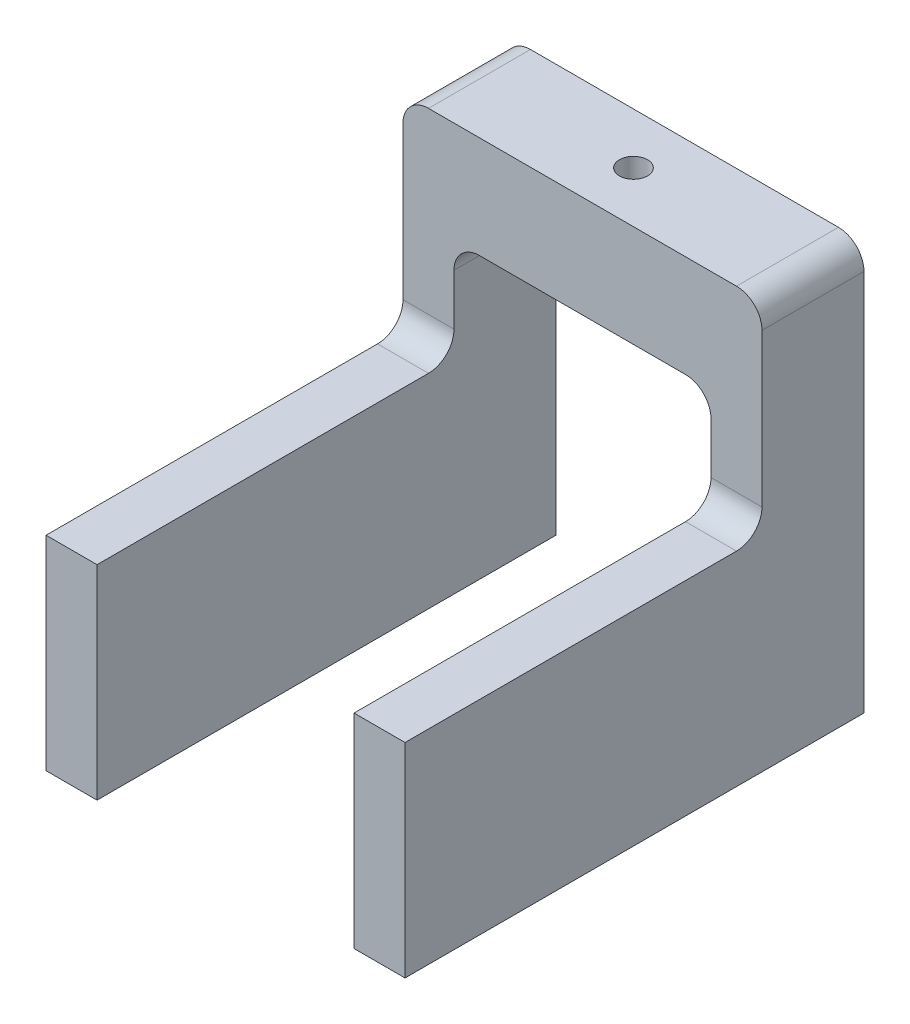
ISO-10303-21;
HEADER;
FILE_DESCRIPTION(('STEP AP214'),'2;1');
FILE_NAME('part.step','',(''),(''),'','','');
FILE_SCHEMA(('AUTOMOTIVE_DESIGN { 1 0 10303 214 1 1 1 1 }'));
ENDSEC;
DATA;
#1=APPLICATION_CONTEXT('core data for automotive mechanical design processes');
#2=APPLICATION_PROTOCOL_DEFINITION('international standard','automotive_design',2000,#1);
#3=PRODUCT_CONTEXT('',#1,'mechanical');
#4=PRODUCT('Part','Part','',(#3));
#5=PRODUCT_RELATED_PRODUCT_CATEGORY('part','',(#4));
#6=PRODUCT_DEFINITION_FORMATION('','',#4);
#7=PRODUCT_DEFINITION_CONTEXT('part definition',#1,'design');
#8=PRODUCT_DEFINITION('design','',#6,#7);
#9=PRODUCT_DEFINITION_SHAPE('','',#8);
#10=(LENGTH_UNIT() NAMED_UNIT(*) SI_UNIT(.MILLI.,.METRE.));
#11=(NAMED_UNIT(*) PLANE_ANGLE_UNIT() SI_UNIT($,.RADIAN.));
#12=(NAMED_UNIT(*) SI_UNIT($,.STERADIAN.) SOLID_ANGLE_UNIT());
#13=UNCERTAINTY_MEASURE_WITH_UNIT(LENGTH_MEASURE(1.E-05),#10,'distance_accuracy_value','');
#14=(GEOMETRIC_REPRESENTATION_CONTEXT(3) GLOBAL_UNCERTAINTY_ASSIGNED_CONTEXT((#13)) GLOBAL_UNIT_ASSIGNED_CONTEXT((#10,
#11,#12)) REPRESENTATION_CONTEXT('',''));
#15=CARTESIAN_POINT('',(0.,0.,0.));
#16=DIRECTION('',(0.,0.,1.));
#17=DIRECTION('',(1.,0.,0.));
#18=AXIS2_PLACEMENT_3D('',#15,#16,#17);
#19=CARTESIAN_POINT('',(89.408,50.8,114.3));
#20=DIRECTION('',(0.,-1.,0.));
#21=DIRECTION('',(0.,0.,-1.));
#22=AXIS2_PLACEMENT_3D('',#19,#20,#21);
#23=PLANE('',#22);
#24=DIRECTION('',(0.,0.,1.));
#25=VECTOR('',#24,1.);
#26=CARTESIAN_POINT('',(89.408,50.8,114.3));
#27=LINE('',#26,#25);
#28=CARTESIAN_POINT('',(89.408,50.8,31.75));
#29=VERTEX_POINT('',#28);
#30=CARTESIAN_POINT('',(89.408,50.8,114.3));
#31=VERTEX_POINT('',#30);
#32=EDGE_CURVE('E307',#29,#31,#27,.T.);
#33=ORIENTED_EDGE('',*,*,#32,.F.);
#34=DIRECTION('',(-1.,0.,0.));
#35=VECTOR('',#34,1.);
#36=CARTESIAN_POINT('',(76.708,50.8,31.75));
#37=LINE('',#36,#35);
#38=CARTESIAN_POINT('',(76.708,50.8,31.75));
#39=VERTEX_POINT('',#38);
#40=EDGE_CURVE('E270',#29,#39,#37,.T.);
#41=ORIENTED_EDGE('',*,*,#40,.T.);
#42=DIRECTION('',(0.,0.,1.));
#43=VECTOR('',#42,1.);
#44=CARTESIAN_POINT('',(76.708,50.8,114.3));
#45=LINE('',#44,#43);
#46=CARTESIAN_POINT('',(76.708,50.8,114.3));
#47=VERTEX_POINT('',#46);
#48=EDGE_CURVE('E293',#39,#47,#45,.T.);
#49=ORIENTED_EDGE('',*,*,#48,.T.);
#50=DIRECTION('',(-1.,0.,0.));
#51=VECTOR('',#50,1.);
#52=CARTESIAN_POINT('',(89.408,50.8,114.3));
#53=LINE('',#52,#51);
#54=EDGE_CURVE('E190',#31,#47,#53,.T.);
#55=ORIENTED_EDGE('',*,*,#54,.F.);
#56=EDGE_LOOP('',(#33,#41,#49,#55));
#57=FACE_BOUND('',#56,.T.);
#58=ADVANCED_FACE('F39',(#57),#23,.F.);
#59=CARTESIAN_POINT('',(89.408,0.,114.3));
#60=DIRECTION('',(0.,0.,-1.));
#61=DIRECTION('',(-1.,0.,0.));
#62=AXIS2_PLACEMENT_3D('',#59,#60,#61);
#63=PLANE('',#62);
#64=ORIENTED_EDGE('',*,*,#54,.T.);
#65=DIRECTION('',(0.,-1.,0.));
#66=VECTOR('',#65,1.);
#67=CARTESIAN_POINT('',(76.708,0.,114.3));
#68=LINE('',#67,#66);
#69=CARTESIAN_POINT('',(76.708,0.,114.3));
#70=VERTEX_POINT('',#69);
#71=EDGE_CURVE('E170',#47,#70,#68,.T.);
#72=ORIENTED_EDGE('',*,*,#71,.T.);
#73=DIRECTION('',(-1.,0.,0.));
#74=VECTOR('',#73,1.);
#75=CARTESIAN_POINT('',(89.408,0.,114.3));
#76=LINE('',#75,#74);
#77=CARTESIAN_POINT('',(89.408,0.,114.3));
#78=VERTEX_POINT('',#77);
#79=EDGE_CURVE('E187',#78,#70,#76,.T.);
#80=ORIENTED_EDGE('',*,*,#79,.F.);
#81=DIRECTION('',(0.,-1.,0.));
#82=VECTOR('',#81,1.);
#83=CARTESIAN_POINT('',(89.408,0.,114.3));
#84=LINE('',#83,#82);
#85=EDGE_CURVE('E311',#31,#78,#84,.T.);
#86=ORIENTED_EDGE('',*,*,#85,.F.);
#87=EDGE_LOOP('',(#64,#72,#80,#86));
#88=FACE_BOUND('',#87,.T.);
#89=ADVANCED_FACE('F185',(#88),#63,.F.);
#90=CARTESIAN_POINT('',(89.408,0.,0.));
#91=DIRECTION('',(0.,1.,0.));
#92=DIRECTION('',(0.,0.,1.));
#93=AXIS2_PLACEMENT_3D('',#90,#91,#92);
#94=PLANE('',#93);
#95=ORIENTED_EDGE('',*,*,#79,.T.);
#96=DIRECTION('',(0.,0.,-1.));
#97=VECTOR('',#96,1.);
#98=CARTESIAN_POINT('',(76.708,0.,114.3));
#99=LINE('',#98,#97);
#100=CARTESIAN_POINT('',(76.708,0.,0.));
#101=VERTEX_POINT('',#100);
#102=EDGE_CURVE('E165',#70,#101,#99,.T.);
#103=ORIENTED_EDGE('',*,*,#102,.T.);
#104=DIRECTION('',(-1.,0.,0.));
#105=VECTOR('',#104,1.);
#106=CARTESIAN_POINT('',(89.408,0.,0.));
#107=LINE('',#106,#105);
#108=CARTESIAN_POINT('',(89.408,0.,0.));
#109=VERTEX_POINT('',#108);
#110=EDGE_CURVE('E204',#109,#101,#107,.T.);
#111=ORIENTED_EDGE('',*,*,#110,.F.);
#112=DIRECTION('',(0.,0.,-1.));
#113=VECTOR('',#112,1.);
#114=CARTESIAN_POINT('',(89.408,0.,0.));
#115=LINE('',#114,#113);
#116=EDGE_CURVE('E195',#78,#109,#115,.T.);
#117=ORIENTED_EDGE('',*,*,#116,.F.);
#118=EDGE_LOOP('',(#95,#103,#111,#117));
#119=FACE_BOUND('',#118,.T.);
#120=ADVANCED_FACE('F194',(#119),#94,.F.);
#121=CARTESIAN_POINT('',(89.408,101.6,0.));
#122=DIRECTION('',(0.,0.,1.));
#123=DIRECTION('',(0.,-1.,0.));
#124=AXIS2_PLACEMENT_3D('',#121,#122,#123);
#125=PLANE('',#124);
#126=DIRECTION('',(-1.,0.,0.));
#127=VECTOR('',#126,1.);
#128=CARTESIAN_POINT('',(89.408,101.6,0.));
#129=LINE('',#128,#127);
#130=CARTESIAN_POINT('',(83.058,101.6,0.));
#131=VERTEX_POINT('',#130);
#132=CARTESIAN_POINT('',(6.34999999999999,101.6,0.));
#133=VERTEX_POINT('',#132);
#134=EDGE_CURVE('E213',#131,#133,#129,.T.);
#135=ORIENTED_EDGE('',*,*,#134,.F.);
#136=CARTESIAN_POINT('',(83.058,95.25,0.));
#137=DIRECTION('',(0.,0.,1.));
#138=DIRECTION('',(0.,-1.,0.));
#139=AXIS2_PLACEMENT_3D('',#136,#137,#138);
#140=CIRCLE('',#139,6.35);
#141=CARTESIAN_POINT('',(89.408,95.25,0.));
#142=VERTEX_POINT('',#141);
#143=EDGE_CURVE('E247',#131,#142,#140,.F.);
#144=ORIENTED_EDGE('',*,*,#143,.T.);
#145=DIRECTION('',(0.,1.,0.));
#146=VECTOR('',#145,1.);
#147=CARTESIAN_POINT('',(89.408,101.6,0.));
#148=LINE('',#147,#146);
#149=EDGE_CURVE('E316',#109,#142,#148,.T.);
#150=ORIENTED_EDGE('',*,*,#149,.F.);
#151=ORIENTED_EDGE('',*,*,#110,.T.);
#152=DIRECTION('',(0.,-1.,0.));
#153=VECTOR('',#152,1.);
#154=CARTESIAN_POINT('',(76.708,0.,0.));
#155=LINE('',#154,#153);
#156=CARTESIAN_POINT('',(76.708,69.85,0.));
#157=VERTEX_POINT('',#156);
#158=EDGE_CURVE('E174',#157,#101,#155,.T.);
#159=ORIENTED_EDGE('',*,*,#158,.F.);
#160=CARTESIAN_POINT('',(70.358,69.85,0.));
#161=DIRECTION('',(0.,0.,1.));
#162=DIRECTION('',(0.,-1.,0.));
#163=AXIS2_PLACEMENT_3D('',#160,#161,#162);
#164=CIRCLE('',#163,6.35);
#165=CARTESIAN_POINT('',(70.358,76.2,0.));
#166=VERTEX_POINT('',#165);
#167=EDGE_CURVE('E273',#157,#166,#164,.T.);
#168=ORIENTED_EDGE('',*,*,#167,.T.);
#169=DIRECTION('',(1.,0.,0.));
#170=VECTOR('',#169,1.);
#171=CARTESIAN_POINT('',(76.708,76.2,0.));
#172=LINE('',#171,#170);
#173=CARTESIAN_POINT('',(19.05,76.2,0.));
#174=VERTEX_POINT('',#173);
#175=EDGE_CURVE('E359',#174,#166,#172,.T.);
#176=ORIENTED_EDGE('',*,*,#175,.F.);
#177=CARTESIAN_POINT('',(19.05,69.85,0.));
#178=DIRECTION('',(0.,0.,1.));
#179=DIRECTION('',(0.,-1.,0.));
#180=AXIS2_PLACEMENT_3D('',#177,#178,#179);
#181=CIRCLE('',#180,6.35);
#182=CARTESIAN_POINT('',(12.7,69.85,0.));
#183=VERTEX_POINT('',#182);
#184=EDGE_CURVE('E279',#174,#183,#181,.T.);
#185=ORIENTED_EDGE('',*,*,#184,.T.);
#186=DIRECTION('',(0.,1.,0.));
#187=VECTOR('',#186,1.);
#188=CARTESIAN_POINT('',(12.7,76.2,0.));
#189=LINE('',#188,#187);
#190=CARTESIAN_POINT('',(12.7,0.,0.));
#191=VERTEX_POINT('',#190);
#192=EDGE_CURVE('E363',#191,#183,#189,.T.);
#193=ORIENTED_EDGE('',*,*,#192,.F.);
#194=CARTESIAN_POINT('',(0.,0.,0.));
#195=VERTEX_POINT('',#194);
#196=EDGE_CURVE('E322',#191,#195,#107,.T.);
#197=ORIENTED_EDGE('',*,*,#196,.T.);
#198=DIRECTION('',(0.,1.,0.));
#199=VECTOR('',#198,1.);
#200=CARTESIAN_POINT('',(0.,101.6,0.));
#201=LINE('',#200,#199);
#202=CARTESIAN_POINT('',(0.,95.25,0.));
#203=VERTEX_POINT('',#202);
#204=EDGE_CURVE('E300',#195,#203,#201,.T.);
#205=ORIENTED_EDGE('',*,*,#204,.T.);
#206=CARTESIAN_POINT('',(6.34999999999999,95.25,0.));
#207=DIRECTION('',(0.,0.,1.));
#208=DIRECTION('',(0.,-1.,0.));
#209=AXIS2_PLACEMENT_3D('',#206,#207,#208);
#210=CIRCLE('',#209,6.35);
#211=EDGE_CURVE('E244',#203,#133,#210,.F.);
#212=ORIENTED_EDGE('',*,*,#211,.T.);
#213=EDGE_LOOP('',(#135,#144,#150,#151,#159,#168,#176,#185,#193,#197,#205,#212));
#214=FACE_BOUND('',#213,.T.);
#215=ADVANCED_FACE('F385',(#214),#125,.F.);
#216=CARTESIAN_POINT('',(89.408,101.6,25.4));
#217=DIRECTION('',(0.,-1.,0.));
#218=DIRECTION('',(0.,0.,-1.));
#219=AXIS2_PLACEMENT_3D('',#216,#217,#218);
#220=PLANE('',#219);
#221=CARTESIAN_POINT('',(44.704,101.6,12.7));
#222=DIRECTION('',(0.,1.,0.));
#223=DIRECTION('',(0.,0.,1.));
#224=AXIS2_PLACEMENT_3D('',#221,#222,#223);
#225=CIRCLE('',#224,3.49999999999999);
#226=CARTESIAN_POINT('',(44.704,101.6,16.2));
#227=VERTEX_POINT('',#226);
#228=EDGE_CURVE('E374',#227,#227,#225,.T.);
#229=ORIENTED_EDGE('',*,*,#228,.F.);
#230=EDGE_LOOP('',(#229));
#231=FACE_BOUND('',#230,.T.);
#232=DIRECTION('',(-1.,0.,0.));
#233=VECTOR('',#232,1.);
#234=CARTESIAN_POINT('',(89.408,101.6,25.4));
#235=LINE('',#234,#233);
#236=CARTESIAN_POINT('',(83.058,101.6,25.4));
#237=VERTEX_POINT('',#236);
#238=CARTESIAN_POINT('',(6.34999999999999,101.6,25.4));
#239=VERTEX_POINT('',#238);
#240=EDGE_CURVE('E209',#237,#239,#235,.T.);
#241=ORIENTED_EDGE('',*,*,#240,.F.);
#242=DIRECTION('',(0.,0.,1.));
#243=VECTOR('',#242,1.);
#244=CARTESIAN_POINT('',(83.058,101.6,25.4));
#245=LINE('',#244,#243);
#246=EDGE_CURVE('E241',#237,#131,#245,.F.);
#247=ORIENTED_EDGE('',*,*,#246,.T.);
#248=ORIENTED_EDGE('',*,*,#134,.T.);
#249=DIRECTION('',(0.,0.,1.));
#250=VECTOR('',#249,1.);
#251=CARTESIAN_POINT('',(6.34999999999999,101.6,25.4));
#252=LINE('',#251,#250);
#253=EDGE_CURVE('E237',#133,#239,#252,.T.);
#254=ORIENTED_EDGE('',*,*,#253,.T.);
#255=EDGE_LOOP('',(#241,#247,#248,#254));
#256=FACE_BOUND('',#255,.T.);
#257=ADVANCED_FACE('F382',(#231,#256),#220,.F.);
#258=CARTESIAN_POINT('',(89.408,50.8,25.4));
#259=DIRECTION('',(0.,0.,-1.));
#260=DIRECTION('',(-1.,0.,0.));
#261=AXIS2_PLACEMENT_3D('',#258,#259,#260);
#262=PLANE('',#261);
#263=DIRECTION('',(0.,-1.,0.));
#264=VECTOR('',#263,1.);
#265=CARTESIAN_POINT('',(89.408,50.8,25.4));
#266=LINE('',#265,#264);
#267=CARTESIAN_POINT('',(89.408,95.25,25.4));
#268=VERTEX_POINT('',#267);
#269=CARTESIAN_POINT('',(89.408,57.15,25.4));
#270=VERTEX_POINT('',#269);
#271=EDGE_CURVE('E308',#268,#270,#266,.T.);
#272=ORIENTED_EDGE('',*,*,#271,.F.);
#273=CARTESIAN_POINT('',(83.058,95.25,25.4));
#274=DIRECTION('',(0.,0.,-1.));
#275=DIRECTION('',(-1.,0.,0.));
#276=AXIS2_PLACEMENT_3D('',#273,#274,#275);
#277=CIRCLE('',#276,6.35);
#278=EDGE_CURVE('E234',#268,#237,#277,.F.);
#279=ORIENTED_EDGE('',*,*,#278,.T.);
#280=ORIENTED_EDGE('',*,*,#240,.T.);
#281=CARTESIAN_POINT('',(6.34999999999999,95.25,25.4));
#282=DIRECTION('',(0.,0.,-1.));
#283=DIRECTION('',(-1.,0.,0.));
#284=AXIS2_PLACEMENT_3D('',#281,#282,#283);
#285=CIRCLE('',#284,6.35);
#286=CARTESIAN_POINT('',(0.,95.25,25.4));
#287=VERTEX_POINT('',#286);
#288=EDGE_CURVE('E231',#239,#287,#285,.F.);
#289=ORIENTED_EDGE('',*,*,#288,.T.);
#290=DIRECTION('',(0.,-1.,0.));
#291=VECTOR('',#290,1.);
#292=CARTESIAN_POINT('',(0.,50.8,25.4));
#293=LINE('',#292,#291);
#294=CARTESIAN_POINT('',(0.,57.15,25.4));
#295=VERTEX_POINT('',#294);
#296=EDGE_CURVE('E326',#287,#295,#293,.T.);
#297=ORIENTED_EDGE('',*,*,#296,.T.);
#298=DIRECTION('',(-1.,0.,0.));
#299=VECTOR('',#298,1.);
#300=CARTESIAN_POINT('',(12.7,57.15,25.4));
#301=LINE('',#300,#299);
#302=CARTESIAN_POINT('',(12.7,57.15,25.4));
#303=VERTEX_POINT('',#302);
#304=EDGE_CURVE('E228',#295,#303,#301,.F.);
#305=ORIENTED_EDGE('',*,*,#304,.T.);
#306=DIRECTION('',(0.,1.,0.));
#307=VECTOR('',#306,1.);
#308=CARTESIAN_POINT('',(12.7,50.8,25.4));
#309=LINE('',#308,#307);
#310=CARTESIAN_POINT('',(12.7,69.85,25.4));
#311=VERTEX_POINT('',#310);
#312=EDGE_CURVE('E349',#303,#311,#309,.T.);
#313=ORIENTED_EDGE('',*,*,#312,.T.);
#314=CARTESIAN_POINT('',(19.05,69.85,25.4));
#315=DIRECTION('',(0.,0.,-1.));
#316=DIRECTION('',(-1.,0.,0.));
#317=AXIS2_PLACEMENT_3D('',#314,#315,#316);
#318=CIRCLE('',#317,6.35);
#319=CARTESIAN_POINT('',(19.05,76.2,25.4));
#320=VERTEX_POINT('',#319);
#321=EDGE_CURVE('E282',#311,#320,#318,.T.);
#322=ORIENTED_EDGE('',*,*,#321,.T.);
#323=DIRECTION('',(1.,0.,0.));
#324=VECTOR('',#323,1.);
#325=CARTESIAN_POINT('',(89.408,76.2,25.4));
#326=LINE('',#325,#324);
#327=CARTESIAN_POINT('',(70.358,76.2,25.4));
#328=VERTEX_POINT('',#327);
#329=EDGE_CURVE('E217',#320,#328,#326,.T.);
#330=ORIENTED_EDGE('',*,*,#329,.T.);
#331=CARTESIAN_POINT('',(70.358,69.85,25.4));
#332=DIRECTION('',(0.,0.,-1.));
#333=DIRECTION('',(-1.,0.,0.));
#334=AXIS2_PLACEMENT_3D('',#331,#332,#333);
#335=CIRCLE('',#334,6.35);
#336=CARTESIAN_POINT('',(76.708,69.85,25.4));
#337=VERTEX_POINT('',#336);
#338=EDGE_CURVE('E276',#328,#337,#335,.T.);
#339=ORIENTED_EDGE('',*,*,#338,.T.);
#340=DIRECTION('',(0.,-1.,0.));
#341=VECTOR('',#340,1.);
#342=CARTESIAN_POINT('',(76.708,50.8,25.4));
#343=LINE('',#342,#341);
#344=CARTESIAN_POINT('',(76.708,57.15,25.4));
#345=VERTEX_POINT('',#344);
#346=EDGE_CURVE('E291',#337,#345,#343,.T.);
#347=ORIENTED_EDGE('',*,*,#346,.T.);
#348=DIRECTION('',(-1.,0.,0.));
#349=VECTOR('',#348,1.);
#350=CARTESIAN_POINT('',(89.408,57.15,25.4));
#351=LINE('',#350,#349);
#352=EDGE_CURVE('E225',#345,#270,#351,.F.);
#353=ORIENTED_EDGE('',*,*,#352,.T.);
#354=EDGE_LOOP('',(#272,#279,#280,#289,#297,#305,#313,#322,#330,#339,#347,#353));
#355=FACE_BOUND('',#354,.T.);
#356=ADVANCED_FACE('F296',(#355),#262,.F.);
#357=DIRECTION('',(0.,0.,-1.));
#358=VECTOR('',#357,1.);
#359=CARTESIAN_POINT('',(12.7,50.8,114.3));
#360=LINE('',#359,#358);
#361=CARTESIAN_POINT('',(12.7,50.8,114.3));
#362=VERTEX_POINT('',#361);
#363=CARTESIAN_POINT('',(12.7,50.8,31.75));
#364=VERTEX_POINT('',#363);
#365=EDGE_CURVE('E180',#362,#364,#360,.T.);
#366=ORIENTED_EDGE('',*,*,#365,.T.);
#367=DIRECTION('',(-1.,0.,0.));
#368=VECTOR('',#367,1.);
#369=CARTESIAN_POINT('',(0.,50.8,31.75));
#370=LINE('',#369,#368);
#371=CARTESIAN_POINT('',(0.,50.8,31.75));
#372=VERTEX_POINT('',#371);
#373=EDGE_CURVE('E266',#364,#372,#370,.T.);
#374=ORIENTED_EDGE('',*,*,#373,.T.);
#375=DIRECTION('',(0.,0.,1.));
#376=VECTOR('',#375,1.);
#377=CARTESIAN_POINT('',(0.,50.8,114.3));
#378=LINE('',#377,#376);
#379=CARTESIAN_POINT('',(0.,50.8,114.3));
#380=VERTEX_POINT('',#379);
#381=EDGE_CURVE('E330',#372,#380,#378,.T.);
#382=ORIENTED_EDGE('',*,*,#381,.T.);
#383=EDGE_CURVE('E197',#362,#380,#53,.T.);
#384=ORIENTED_EDGE('',*,*,#383,.F.);
#385=EDGE_LOOP('',(#366,#374,#382,#384));
#386=FACE_BOUND('',#385,.T.);
#387=ADVANCED_FACE('F409',(#386),#23,.F.);
#388=CARTESIAN_POINT('',(12.7,0.,114.3));
#389=VERTEX_POINT('',#388);
#390=CARTESIAN_POINT('',(0.,0.,114.3));
#391=VERTEX_POINT('',#390);
#392=EDGE_CURVE('E198',#389,#391,#76,.T.);
#393=ORIENTED_EDGE('',*,*,#392,.F.);
#394=DIRECTION('',(0.,1.,0.));
#395=VECTOR('',#394,1.);
#396=CARTESIAN_POINT('',(12.7,76.2,114.3));
#397=LINE('',#396,#395);
#398=EDGE_CURVE('E192',#389,#362,#397,.T.);
#399=ORIENTED_EDGE('',*,*,#398,.T.);
#400=ORIENTED_EDGE('',*,*,#383,.T.);
#401=DIRECTION('',(0.,-1.,0.));
#402=VECTOR('',#401,1.);
#403=CARTESIAN_POINT('',(0.,0.,114.3));
#404=LINE('',#403,#402);
#405=EDGE_CURVE('E333',#380,#391,#404,.T.);
#406=ORIENTED_EDGE('',*,*,#405,.T.);
#407=EDGE_LOOP('',(#393,#399,#400,#406));
#408=FACE_BOUND('',#407,.T.);
#409=ADVANCED_FACE('F415',(#408),#63,.F.);
#410=ORIENTED_EDGE('',*,*,#196,.F.);
#411=DIRECTION('',(0.,0.,-1.));
#412=VECTOR('',#411,1.);
#413=CARTESIAN_POINT('',(12.7,0.,114.3));
#414=LINE('',#413,#412);
#415=EDGE_CURVE('E181',#389,#191,#414,.T.);
#416=ORIENTED_EDGE('',*,*,#415,.F.);
#417=ORIENTED_EDGE('',*,*,#392,.T.);
#418=DIRECTION('',(0.,0.,-1.));
#419=VECTOR('',#418,1.);
#420=CARTESIAN_POINT('',(0.,0.,0.));
#421=LINE('',#420,#419);
#422=EDGE_CURVE('E336',#391,#195,#421,.T.);
#423=ORIENTED_EDGE('',*,*,#422,.T.);
#424=EDGE_LOOP('',(#410,#416,#417,#423));
#425=FACE_BOUND('',#424,.T.);
#426=ADVANCED_FACE('F416',(#425),#94,.F.);
#427=CARTESIAN_POINT('',(89.408,0.,0.));
#428=DIRECTION('',(-1.,0.,0.));
#429=DIRECTION('',(0.,0.,1.));
#430=AXIS2_PLACEMENT_3D('',#427,#428,#429);
#431=PLANE('',#430);
#432=ORIENTED_EDGE('',*,*,#149,.T.);
#433=DIRECTION('',(0.,0.,1.));
#434=VECTOR('',#433,1.);
#435=CARTESIAN_POINT('',(89.408,95.25,0.));
#436=LINE('',#435,#434);
#437=EDGE_CURVE('E221',#142,#268,#436,.T.);
#438=ORIENTED_EDGE('',*,*,#437,.T.);
#439=ORIENTED_EDGE('',*,*,#271,.T.);
#440=CARTESIAN_POINT('',(89.408,57.15,31.75));
#441=DIRECTION('',(-1.,0.,0.));
#442=DIRECTION('',(0.,0.,1.));
#443=AXIS2_PLACEMENT_3D('',#440,#441,#442);
#444=CIRCLE('',#443,6.35);
#445=EDGE_CURVE('E11',#270,#29,#444,.T.);
#446=ORIENTED_EDGE('',*,*,#445,.T.);
#447=ORIENTED_EDGE('',*,*,#32,.T.);
#448=ORIENTED_EDGE('',*,*,#85,.T.);
#449=ORIENTED_EDGE('',*,*,#116,.T.);
#450=EDGE_LOOP('',(#432,#438,#439,#446,#447,#448,#449));
#451=FACE_BOUND('',#450,.T.);
#452=ADVANCED_FACE('F306',(#451),#431,.F.);
#453=CARTESIAN_POINT('',(0.,0.,0.));
#454=DIRECTION('',(-1.,0.,0.));
#455=DIRECTION('',(0.,0.,1.));
#456=AXIS2_PLACEMENT_3D('',#453,#454,#455);
#457=PLANE('',#456);
#458=ORIENTED_EDGE('',*,*,#296,.F.);
#459=DIRECTION('',(0.,0.,1.));
#460=VECTOR('',#459,1.);
#461=CARTESIAN_POINT('',(0.,95.25,0.));
#462=LINE('',#461,#460);
#463=EDGE_CURVE('E250',#287,#203,#462,.F.);
#464=ORIENTED_EDGE('',*,*,#463,.T.);
#465=ORIENTED_EDGE('',*,*,#204,.F.);
#466=ORIENTED_EDGE('',*,*,#422,.F.);
#467=ORIENTED_EDGE('',*,*,#405,.F.);
#468=ORIENTED_EDGE('',*,*,#381,.F.);
#469=CARTESIAN_POINT('',(0.,57.15,31.75));
#470=DIRECTION('',(-1.,0.,0.));
#471=DIRECTION('',(0.,0.,1.));
#472=AXIS2_PLACEMENT_3D('',#469,#470,#471);
#473=CIRCLE('',#472,6.35);
#474=EDGE_CURVE('E285',#372,#295,#473,.F.);
#475=ORIENTED_EDGE('',*,*,#474,.T.);
#476=EDGE_LOOP('',(#458,#464,#465,#466,#467,#468,#475));
#477=FACE_BOUND('',#476,.T.);
#478=ADVANCED_FACE('F402',(#477),#457,.T.);
#479=CARTESIAN_POINT('',(76.708,76.2,114.3));
#480=DIRECTION('',(0.,1.,0.));
#481=DIRECTION('',(0.,0.,1.));
#482=AXIS2_PLACEMENT_3D('',#479,#480,#481);
#483=PLANE('',#482);
#484=CARTESIAN_POINT('',(44.704,76.2,12.7));
#485=DIRECTION('',(0.,1.,0.));
#486=DIRECTION('',(0.,0.,1.));
#487=AXIS2_PLACEMENT_3D('',#484,#485,#486);
#488=CIRCLE('',#487,3.49999999999999);
#489=CARTESIAN_POINT('',(44.704,76.2,16.2));
#490=VERTEX_POINT('',#489);
#491=EDGE_CURVE('E366',#490,#490,#488,.T.);
#492=ORIENTED_EDGE('',*,*,#491,.T.);
#493=EDGE_LOOP('',(#492));
#494=FACE_BOUND('',#493,.T.);
#495=ORIENTED_EDGE('',*,*,#175,.T.);
#496=DIRECTION('',(0.,0.,-1.));
#497=VECTOR('',#496,1.);
#498=CARTESIAN_POINT('',(70.358,76.2,25.4));
#499=LINE('',#498,#497);
#500=EDGE_CURVE('E260',#166,#328,#499,.F.);
#501=ORIENTED_EDGE('',*,*,#500,.T.);
#502=ORIENTED_EDGE('',*,*,#329,.F.);
#503=DIRECTION('',(0.,0.,-1.));
#504=VECTOR('',#503,1.);
#505=CARTESIAN_POINT('',(19.05,76.2,0.));
#506=LINE('',#505,#504);
#507=EDGE_CURVE('E256',#320,#174,#506,.T.);
#508=ORIENTED_EDGE('',*,*,#507,.T.);
#509=EDGE_LOOP('',(#495,#501,#502,#508));
#510=FACE_BOUND('',#509,.T.);
#511=ADVANCED_FACE('F426',(#494,#510),#483,.F.);
#512=CARTESIAN_POINT('',(76.708,0.,114.3));
#513=DIRECTION('',(1.,0.,0.));
#514=DIRECTION('',(0.,0.,-1.));
#515=AXIS2_PLACEMENT_3D('',#512,#513,#514);
#516=PLANE('',#515);
#517=ORIENTED_EDGE('',*,*,#346,.F.);
#518=DIRECTION('',(0.,0.,-1.));
#519=VECTOR('',#518,1.);
#520=CARTESIAN_POINT('',(76.708,69.85,0.));
#521=LINE('',#520,#519);
#522=EDGE_CURVE('E253',#337,#157,#521,.T.);
#523=ORIENTED_EDGE('',*,*,#522,.T.);
#524=ORIENTED_EDGE('',*,*,#158,.T.);
#525=ORIENTED_EDGE('',*,*,#102,.F.);
#526=ORIENTED_EDGE('',*,*,#71,.F.);
#527=ORIENTED_EDGE('',*,*,#48,.F.);
#528=CARTESIAN_POINT('',(76.708,57.15,31.75));
#529=DIRECTION('',(1.,0.,0.));
#530=DIRECTION('',(0.,0.,-1.));
#531=AXIS2_PLACEMENT_3D('',#528,#529,#530);
#532=CIRCLE('',#531,6.35);
#533=EDGE_CURVE('E48',#39,#345,#532,.T.);
#534=ORIENTED_EDGE('',*,*,#533,.T.);
#535=EDGE_LOOP('',(#517,#523,#524,#525,#526,#527,#534));
#536=FACE_BOUND('',#535,.T.);
#537=ADVANCED_FACE('F168',(#536),#516,.F.);
#538=CARTESIAN_POINT('',(12.7,76.2,114.3));
#539=DIRECTION('',(-1.,0.,0.));
#540=DIRECTION('',(0.,-1.,0.));
#541=AXIS2_PLACEMENT_3D('',#538,#539,#540);
#542=PLANE('',#541);
#543=ORIENTED_EDGE('',*,*,#192,.T.);
#544=DIRECTION('',(0.,0.,-1.));
#545=VECTOR('',#544,1.);
#546=CARTESIAN_POINT('',(12.7,69.85,25.4));
#547=LINE('',#546,#545);
#548=EDGE_CURVE('E263',#183,#311,#547,.F.);
#549=ORIENTED_EDGE('',*,*,#548,.T.);
#550=ORIENTED_EDGE('',*,*,#312,.F.);
#551=CARTESIAN_POINT('',(12.7,57.15,31.75));
#552=DIRECTION('',(-1.,0.,0.));
#553=DIRECTION('',(0.,-1.,0.));
#554=AXIS2_PLACEMENT_3D('',#551,#552,#553);
#555=CIRCLE('',#554,6.35);
#556=EDGE_CURVE('E55',#303,#364,#555,.T.);
#557=ORIENTED_EDGE('',*,*,#556,.T.);
#558=ORIENTED_EDGE('',*,*,#365,.F.);
#559=ORIENTED_EDGE('',*,*,#398,.F.);
#560=ORIENTED_EDGE('',*,*,#415,.T.);
#561=EDGE_LOOP('',(#543,#549,#550,#557,#558,#559,#560));
#562=FACE_BOUND('',#561,.T.);
#563=ADVANCED_FACE('F411',(#562),#542,.F.);
#564=CARTESIAN_POINT('',(44.704,101.6,12.7));
#565=DIRECTION('',(0.,1.,0.));
#566=DIRECTION('',(0.,0.,1.));
#567=AXIS2_PLACEMENT_3D('',#564,#565,#566);
#568=CYLINDRICAL_SURFACE('',#567,3.49999999999999);
#569=ORIENTED_EDGE('',*,*,#228,.T.);
#570=EDGE_LOOP('',(#569));
#571=FACE_BOUND('',#570,.T.);
#572=ORIENTED_EDGE('',*,*,#491,.F.);
#573=EDGE_LOOP('',(#572));
#574=FACE_BOUND('',#573,.T.);
#575=ADVANCED_FACE('F379',(#571,#574),#568,.F.);
#576=CARTESIAN_POINT('',(83.058,95.25,0.));
#577=DIRECTION('',(0.,0.,1.));
#578=DIRECTION('',(1.,0.,0.));
#579=AXIS2_PLACEMENT_3D('',#576,#577,#578);
#580=CYLINDRICAL_SURFACE('',#579,6.35);
#581=ORIENTED_EDGE('',*,*,#143,.F.);
#582=ORIENTED_EDGE('',*,*,#246,.F.);
#583=ORIENTED_EDGE('',*,*,#278,.F.);
#584=ORIENTED_EDGE('',*,*,#437,.F.);
#585=EDGE_LOOP('',(#581,#582,#583,#584));
#586=FACE_BOUND('',#585,.T.);
#587=ADVANCED_FACE('F393',(#586),#580,.T.);
#588=CARTESIAN_POINT('',(6.34999999999999,95.25,25.4));
#589=DIRECTION('',(0.,0.,-1.));
#590=DIRECTION('',(-1.,0.,0.));
#591=AXIS2_PLACEMENT_3D('',#588,#589,#590);
#592=CYLINDRICAL_SURFACE('',#591,6.35);
#593=ORIENTED_EDGE('',*,*,#211,.F.);
#594=ORIENTED_EDGE('',*,*,#463,.F.);
#595=ORIENTED_EDGE('',*,*,#288,.F.);
#596=ORIENTED_EDGE('',*,*,#253,.F.);
#597=EDGE_LOOP('',(#593,#594,#595,#596));
#598=FACE_BOUND('',#597,.T.);
#599=ADVANCED_FACE('F397',(#598),#592,.T.);
#600=CARTESIAN_POINT('',(70.358,69.85,114.3));
#601=DIRECTION('',(0.,0.,1.));
#602=DIRECTION('',(0.,-1.,0.));
#603=AXIS2_PLACEMENT_3D('',#600,#601,#602);
#604=CYLINDRICAL_SURFACE('',#603,6.35);
#605=ORIENTED_EDGE('',*,*,#338,.F.);
#606=ORIENTED_EDGE('',*,*,#500,.F.);
#607=ORIENTED_EDGE('',*,*,#167,.F.);
#608=ORIENTED_EDGE('',*,*,#522,.F.);
#609=EDGE_LOOP('',(#605,#606,#607,#608));
#610=FACE_BOUND('',#609,.T.);
#611=ADVANCED_FACE('F429',(#610),#604,.F.);
#612=CARTESIAN_POINT('',(19.05,69.85,114.3));
#613=DIRECTION('',(0.,0.,1.));
#614=DIRECTION('',(0.,-1.,0.));
#615=AXIS2_PLACEMENT_3D('',#612,#613,#614);
#616=CYLINDRICAL_SURFACE('',#615,6.35);
#617=ORIENTED_EDGE('',*,*,#321,.F.);
#618=ORIENTED_EDGE('',*,*,#548,.F.);
#619=ORIENTED_EDGE('',*,*,#184,.F.);
#620=ORIENTED_EDGE('',*,*,#507,.F.);
#621=EDGE_LOOP('',(#617,#618,#619,#620));
#622=FACE_BOUND('',#621,.T.);
#623=ADVANCED_FACE('F423',(#622),#616,.F.);
#624=CARTESIAN_POINT('',(89.408,57.15,31.75));
#625=DIRECTION('',(1.,0.,0.));
#626=DIRECTION('',(0.,0.,-1.));
#627=AXIS2_PLACEMENT_3D('',#624,#625,#626);
#628=CYLINDRICAL_SURFACE('',#627,6.35);
#629=ORIENTED_EDGE('',*,*,#556,.F.);
#630=ORIENTED_EDGE('',*,*,#304,.F.);
#631=ORIENTED_EDGE('',*,*,#474,.F.);
#632=ORIENTED_EDGE('',*,*,#373,.F.);
#633=EDGE_LOOP('',(#629,#630,#631,#632));
#634=FACE_BOUND('',#633,.T.);
#635=ADVANCED_FACE('F407',(#634),#628,.F.);
#636=CARTESIAN_POINT('',(89.408,57.15,31.75));
#637=DIRECTION('',(1.,0.,0.));
#638=DIRECTION('',(0.,0.,-1.));
#639=AXIS2_PLACEMENT_3D('',#636,#637,#638);
#640=CYLINDRICAL_SURFACE('',#639,6.35);
#641=ORIENTED_EDGE('',*,*,#445,.F.);
#642=ORIENTED_EDGE('',*,*,#352,.F.);
#643=ORIENTED_EDGE('',*,*,#533,.F.);
#644=ORIENTED_EDGE('',*,*,#40,.F.);
#645=EDGE_LOOP('',(#641,#642,#643,#644));
#646=FACE_BOUND('',#645,.T.);
#647=ADVANCED_FACE('F41',(#646),#640,.F.);
#648=CLOSED_SHELL('',(#58,#89,#120,#215,#257,#356,#387,#409,#426,#452,#478,#511,#537,#563,#575,
#587,#599,#611,#623,#635,#647));
#649=MANIFOLD_SOLID_BREP('B2',#648);
#650=ADVANCED_BREP_SHAPE_REPRESENTATION('',(#18,#649),#14);
#651=SHAPE_DEFINITION_REPRESENTATION(#9,#650);
ENDSEC;
END-ISO-10303-21;
